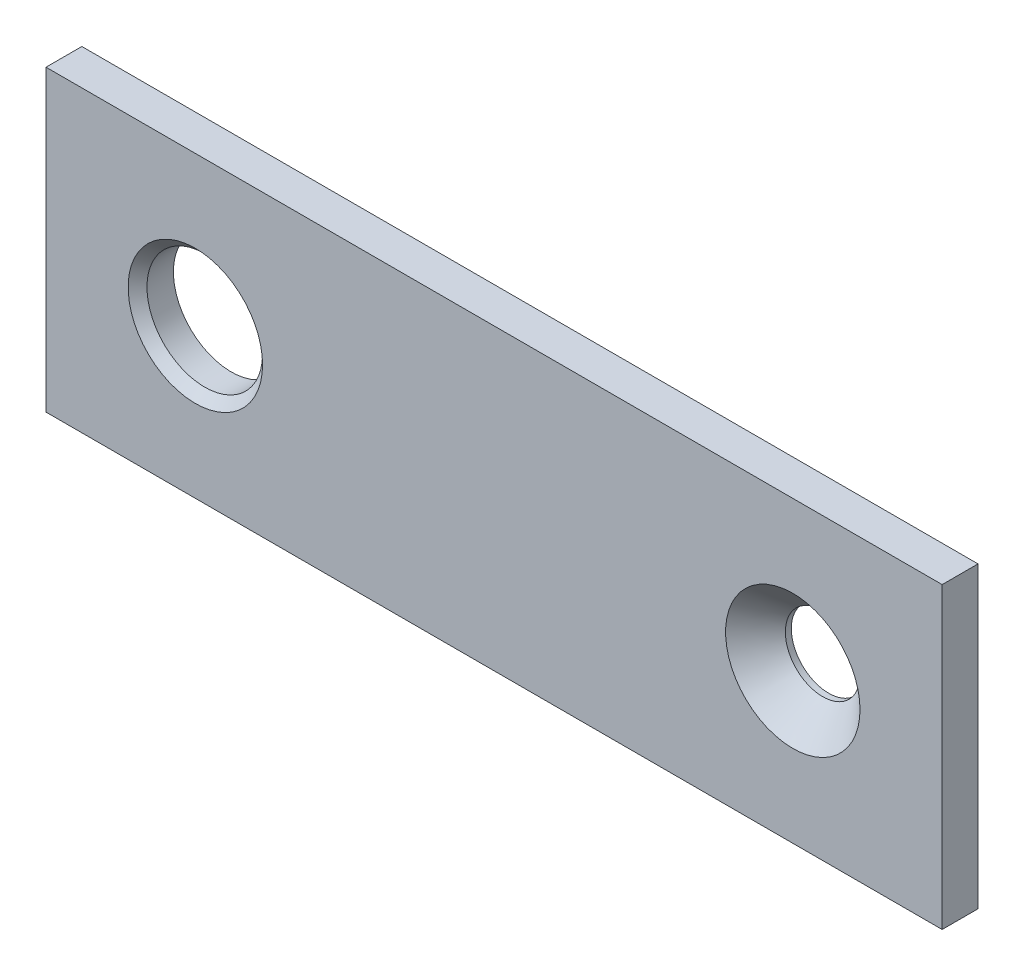
ISO-10303-21;
HEADER;
FILE_DESCRIPTION(('STEP AP214'),'2;1');
FILE_NAME('part.step','',(''),(''),'','','');
FILE_SCHEMA(('AUTOMOTIVE_DESIGN { 1 0 10303 214 1 1 1 1 }'));
ENDSEC;
DATA;
#1=APPLICATION_CONTEXT('core data for automotive mechanical design processes');
#2=APPLICATION_PROTOCOL_DEFINITION('international standard','automotive_design',2000,#1);
#3=PRODUCT_CONTEXT('',#1,'mechanical');
#4=PRODUCT('Part','Part','',(#3));
#5=PRODUCT_RELATED_PRODUCT_CATEGORY('part','',(#4));
#6=PRODUCT_DEFINITION_FORMATION('','',#4);
#7=PRODUCT_DEFINITION_CONTEXT('part definition',#1,'design');
#8=PRODUCT_DEFINITION('design','',#6,#7);
#9=PRODUCT_DEFINITION_SHAPE('','',#8);
#10=(LENGTH_UNIT() NAMED_UNIT(*) SI_UNIT(.MILLI.,.METRE.));
#11=(NAMED_UNIT(*) PLANE_ANGLE_UNIT() SI_UNIT($,.RADIAN.));
#12=(NAMED_UNIT(*) SI_UNIT($,.STERADIAN.) SOLID_ANGLE_UNIT());
#13=UNCERTAINTY_MEASURE_WITH_UNIT(LENGTH_MEASURE(1.E-05),#10,'distance_accuracy_value','');
#14=(GEOMETRIC_REPRESENTATION_CONTEXT(3) GLOBAL_UNCERTAINTY_ASSIGNED_CONTEXT((#13)) GLOBAL_UNIT_ASSIGNED_CONTEXT((#10,
#11,#12)) REPRESENTATION_CONTEXT('',''));
#15=CARTESIAN_POINT('',(0.,0.,0.));
#16=DIRECTION('',(0.,0.,1.));
#17=DIRECTION('',(1.,0.,0.));
#18=AXIS2_PLACEMENT_3D('',#15,#16,#17);
#19=CARTESIAN_POINT('',(-19.05,6.34999999999999,-1.524));
#20=DIRECTION('',(-1.,0.,0.));
#21=DIRECTION('',(0.,-1.,0.));
#22=AXIS2_PLACEMENT_3D('',#19,#20,#21);
#23=PLANE('',#22);
#24=DIRECTION('',(0.,-1.,0.));
#25=VECTOR('',#24,1.);
#26=CARTESIAN_POINT('',(-19.05,6.34999999999999,0.));
#27=LINE('',#26,#25);
#28=CARTESIAN_POINT('',(-19.05,6.34999999999999,0.));
#29=VERTEX_POINT('',#28);
#30=CARTESIAN_POINT('',(-19.05,-6.35000000000001,0.));
#31=VERTEX_POINT('',#30);
#32=EDGE_CURVE('E117',#29,#31,#27,.T.);
#33=ORIENTED_EDGE('',*,*,#32,.F.);
#34=DIRECTION('',(0.,0.,1.));
#35=VECTOR('',#34,1.);
#36=CARTESIAN_POINT('',(-19.05,6.34999999999999,-1.524));
#37=LINE('',#36,#35);
#38=CARTESIAN_POINT('',(-19.05,6.34999999999999,-1.524));
#39=VERTEX_POINT('',#38);
#40=EDGE_CURVE('E65',#39,#29,#37,.T.);
#41=ORIENTED_EDGE('',*,*,#40,.F.);
#42=DIRECTION('',(0.,-1.,0.));
#43=VECTOR('',#42,1.);
#44=CARTESIAN_POINT('',(-19.05,6.34999999999999,-1.524));
#45=LINE('',#44,#43);
#46=CARTESIAN_POINT('',(-19.05,-6.35000000000001,-1.524));
#47=VERTEX_POINT('',#46);
#48=EDGE_CURVE('E110',#39,#47,#45,.T.);
#49=ORIENTED_EDGE('',*,*,#48,.T.);
#50=DIRECTION('',(0.,0.,1.));
#51=VECTOR('',#50,1.);
#52=CARTESIAN_POINT('',(-19.05,-6.35000000000001,-1.524));
#53=LINE('',#52,#51);
#54=EDGE_CURVE('E93',#47,#31,#53,.T.);
#55=ORIENTED_EDGE('',*,*,#54,.T.);
#56=EDGE_LOOP('',(#33,#41,#49,#55));
#57=FACE_BOUND('',#56,.T.);
#58=ADVANCED_FACE('F47',(#57),#23,.T.);
#59=CARTESIAN_POINT('',(-19.05,6.34999999999999,-1.524));
#60=DIRECTION('',(0.,1.,0.));
#61=DIRECTION('',(0.,0.,1.));
#62=AXIS2_PLACEMENT_3D('',#59,#60,#61);
#63=PLANE('',#62);
#64=DIRECTION('',(-1.,0.,0.));
#65=VECTOR('',#64,1.);
#66=CARTESIAN_POINT('',(-19.05,6.34999999999999,0.));
#67=LINE('',#66,#65);
#68=CARTESIAN_POINT('',(19.05,6.34999999999999,0.));
#69=VERTEX_POINT('',#68);
#70=EDGE_CURVE('E112',#69,#29,#67,.T.);
#71=ORIENTED_EDGE('',*,*,#70,.F.);
#72=DIRECTION('',(0.,0.,1.));
#73=VECTOR('',#72,1.);
#74=CARTESIAN_POINT('',(19.05,6.34999999999999,-1.524));
#75=LINE('',#74,#73);
#76=CARTESIAN_POINT('',(19.05,6.34999999999999,-1.524));
#77=VERTEX_POINT('',#76);
#78=EDGE_CURVE('E82',#77,#69,#75,.T.);
#79=ORIENTED_EDGE('',*,*,#78,.F.);
#80=DIRECTION('',(-1.,0.,0.));
#81=VECTOR('',#80,1.);
#82=CARTESIAN_POINT('',(-19.05,6.34999999999999,-1.524));
#83=LINE('',#82,#81);
#84=EDGE_CURVE('E107',#77,#39,#83,.T.);
#85=ORIENTED_EDGE('',*,*,#84,.T.);
#86=ORIENTED_EDGE('',*,*,#40,.T.);
#87=EDGE_LOOP('',(#71,#79,#85,#86));
#88=FACE_BOUND('',#87,.T.);
#89=ADVANCED_FACE('F152',(#88),#63,.T.);
#90=CARTESIAN_POINT('',(19.05,6.34999999999999,-1.524));
#91=DIRECTION('',(1.,0.,0.));
#92=DIRECTION('',(0.,0.,-1.));
#93=AXIS2_PLACEMENT_3D('',#90,#91,#92);
#94=PLANE('',#93);
#95=DIRECTION('',(0.,1.,0.));
#96=VECTOR('',#95,1.);
#97=CARTESIAN_POINT('',(19.05,6.34999999999999,0.));
#98=LINE('',#97,#96);
#99=CARTESIAN_POINT('',(19.05,-6.35000000000001,0.));
#100=VERTEX_POINT('',#99);
#101=EDGE_CURVE('E101',#100,#69,#98,.T.);
#102=ORIENTED_EDGE('',*,*,#101,.F.);
#103=DIRECTION('',(0.,0.,1.));
#104=VECTOR('',#103,1.);
#105=CARTESIAN_POINT('',(19.05,-6.35000000000001,-1.524));
#106=LINE('',#105,#104);
#107=CARTESIAN_POINT('',(19.05,-6.35000000000001,-1.524));
#108=VERTEX_POINT('',#107);
#109=EDGE_CURVE('E96',#108,#100,#106,.T.);
#110=ORIENTED_EDGE('',*,*,#109,.F.);
#111=DIRECTION('',(0.,1.,0.));
#112=VECTOR('',#111,1.);
#113=CARTESIAN_POINT('',(19.05,6.34999999999999,-1.524));
#114=LINE('',#113,#112);
#115=EDGE_CURVE('E99',#108,#77,#114,.T.);
#116=ORIENTED_EDGE('',*,*,#115,.T.);
#117=ORIENTED_EDGE('',*,*,#78,.T.);
#118=EDGE_LOOP('',(#102,#110,#116,#117));
#119=FACE_BOUND('',#118,.T.);
#120=ADVANCED_FACE('F98',(#119),#94,.T.);
#121=CARTESIAN_POINT('',(-19.05,-6.35000000000001,-1.524));
#122=DIRECTION('',(0.,-1.,0.));
#123=DIRECTION('',(1.,0.,0.));
#124=AXIS2_PLACEMENT_3D('',#121,#122,#123);
#125=PLANE('',#124);
#126=DIRECTION('',(1.,0.,0.));
#127=VECTOR('',#126,1.);
#128=CARTESIAN_POINT('',(-19.05,-6.35000000000001,0.));
#129=LINE('',#128,#127);
#130=EDGE_CURVE('E120',#31,#100,#129,.T.);
#131=ORIENTED_EDGE('',*,*,#130,.F.);
#132=ORIENTED_EDGE('',*,*,#54,.F.);
#133=DIRECTION('',(1.,0.,0.));
#134=VECTOR('',#133,1.);
#135=CARTESIAN_POINT('',(-19.05,-6.35000000000001,-1.524));
#136=LINE('',#135,#134);
#137=EDGE_CURVE('E106',#47,#108,#136,.T.);
#138=ORIENTED_EDGE('',*,*,#137,.T.);
#139=ORIENTED_EDGE('',*,*,#109,.T.);
#140=EDGE_LOOP('',(#131,#132,#138,#139));
#141=FACE_BOUND('',#140,.T.);
#142=ADVANCED_FACE('F109',(#141),#125,.T.);
#143=CARTESIAN_POINT('',(-19.05,-6.35000000000001,-1.524));
#144=DIRECTION('',(0.,0.,1.));
#145=DIRECTION('',(1.,0.,0.));
#146=AXIS2_PLACEMENT_3D('',#143,#144,#145);
#147=PLANE('',#146);
#148=CARTESIAN_POINT('',(-12.7,0.,-1.524));
#149=DIRECTION('',(0.,0.,1.));
#150=DIRECTION('',(1.,0.,0.));
#151=AXIS2_PLACEMENT_3D('',#148,#149,#150);
#152=CIRCLE('',#151,2.45745);
#153=CARTESIAN_POINT('',(-10.24255,0.,-1.524));
#154=VERTEX_POINT('',#153);
#155=EDGE_CURVE('E179',#154,#154,#152,.T.);
#156=ORIENTED_EDGE('',*,*,#155,.T.);
#157=EDGE_LOOP('',(#156));
#158=FACE_BOUND('',#157,.T.);
#159=CARTESIAN_POINT('',(12.7,0.,-1.524));
#160=DIRECTION('',(0.,0.,1.));
#161=DIRECTION('',(1.,0.,0.));
#162=AXIS2_PLACEMENT_3D('',#159,#160,#161);
#163=CIRCLE('',#162,1.5875);
#164=CARTESIAN_POINT('',(14.2875,0.,-1.524));
#165=VERTEX_POINT('',#164);
#166=EDGE_CURVE('E121',#165,#165,#163,.T.);
#167=ORIENTED_EDGE('',*,*,#166,.T.);
#168=EDGE_LOOP('',(#167));
#169=FACE_BOUND('',#168,.T.);
#170=ORIENTED_EDGE('',*,*,#48,.F.);
#171=ORIENTED_EDGE('',*,*,#84,.F.);
#172=ORIENTED_EDGE('',*,*,#115,.F.);
#173=ORIENTED_EDGE('',*,*,#137,.F.);
#174=EDGE_LOOP('',(#170,#171,#172,#173));
#175=FACE_BOUND('',#174,.T.);
#176=ADVANCED_FACE('F105',(#158,#169,#175),#147,.F.);
#177=CARTESIAN_POINT('',(-19.05,-6.35000000000001,0.));
#178=DIRECTION('',(0.,0.,1.));
#179=DIRECTION('',(1.,0.,0.));
#180=AXIS2_PLACEMENT_3D('',#177,#178,#179);
#181=PLANE('',#180);
#182=CARTESIAN_POINT('',(12.7,0.,0.));
#183=DIRECTION('',(0.,0.,1.));
#184=DIRECTION('',(1.,0.,0.));
#185=AXIS2_PLACEMENT_3D('',#182,#183,#184);
#186=CIRCLE('',#185,2.85750000000003);
#187=CARTESIAN_POINT('',(15.5575,0.,0.));
#188=VERTEX_POINT('',#187);
#189=EDGE_CURVE('E13',#188,#188,#186,.F.);
#190=ORIENTED_EDGE('',*,*,#189,.T.);
#191=EDGE_LOOP('',(#190));
#192=FACE_BOUND('',#191,.T.);
#193=CARTESIAN_POINT('',(-12.7,0.,0.));
#194=DIRECTION('',(0.,0.,1.));
#195=DIRECTION('',(1.,0.,0.));
#196=AXIS2_PLACEMENT_3D('',#193,#194,#195);
#197=CIRCLE('',#196,2.85750000000003);
#198=CARTESIAN_POINT('',(-9.84249999999996,0.,0.));
#199=VERTEX_POINT('',#198);
#200=EDGE_CURVE('E57',#199,#199,#197,.F.);
#201=ORIENTED_EDGE('',*,*,#200,.T.);
#202=EDGE_LOOP('',(#201));
#203=FACE_BOUND('',#202,.T.);
#204=ORIENTED_EDGE('',*,*,#32,.T.);
#205=ORIENTED_EDGE('',*,*,#130,.T.);
#206=ORIENTED_EDGE('',*,*,#101,.T.);
#207=ORIENTED_EDGE('',*,*,#70,.T.);
#208=EDGE_LOOP('',(#204,#205,#206,#207));
#209=FACE_BOUND('',#208,.T.);
#210=ADVANCED_FACE('F135',(#192,#203,#209),#181,.T.);
#211=CARTESIAN_POINT('',(12.7,0.,-1.524));
#212=DIRECTION('',(0.,0.,1.));
#213=DIRECTION('',(1.,0.,0.));
#214=AXIS2_PLACEMENT_3D('',#211,#212,#213);
#215=CYLINDRICAL_SURFACE('',#214,1.5875);
#216=CARTESIAN_POINT('',(12.7,0.,-1.27000000000002));
#217=DIRECTION('',(0.,0.,1.));
#218=DIRECTION('',(1.,0.,0.));
#219=AXIS2_PLACEMENT_3D('',#216,#217,#218);
#220=CIRCLE('',#219,1.5875);
#221=CARTESIAN_POINT('',(14.2875,0.,-1.27000000000002));
#222=VERTEX_POINT('',#221);
#223=EDGE_CURVE('E127',#222,#222,#220,.T.);
#224=CARTESIAN_POINT('',(14.2875,0.,-1.27000000000002));
#225=CARTESIAN_POINT('',(14.2875,0.,-1.27264583333335));
#226=CARTESIAN_POINT('',(14.2875,0.,-1.27529166666668));
#227=CARTESIAN_POINT('',(14.2875,0.,-1.28058333333335));
#228=CARTESIAN_POINT('',(14.2875,0.,-1.28322916666668));
#229=CARTESIAN_POINT('',(14.2875,0.,-1.28852083333335));
#230=CARTESIAN_POINT('',(14.2875,0.,-1.29116666666668));
#231=CARTESIAN_POINT('',(14.2875,0.,-1.29645833333335));
#232=CARTESIAN_POINT('',(14.2875,0.,-1.29910416666668));
#233=CARTESIAN_POINT('',(14.2875,0.,-1.30439583333335));
#234=CARTESIAN_POINT('',(14.2875,0.,-1.30704166666668));
#235=CARTESIAN_POINT('',(14.2875,0.,-1.31233333333335));
#236=CARTESIAN_POINT('',(14.2875,0.,-1.31497916666668));
#237=CARTESIAN_POINT('',(14.2875,0.,-1.32027083333335));
#238=CARTESIAN_POINT('',(14.2875,0.,-1.32291666666668));
#239=CARTESIAN_POINT('',(14.2875,0.,-1.32820833333335));
#240=CARTESIAN_POINT('',(14.2875,0.,-1.33085416666668));
#241=CARTESIAN_POINT('',(14.2875,0.,-1.33614583333335));
#242=CARTESIAN_POINT('',(14.2875,0.,-1.33879166666668));
#243=CARTESIAN_POINT('',(14.2875,0.,-1.34408333333335));
#244=CARTESIAN_POINT('',(14.2875,0.,-1.34672916666668));
#245=CARTESIAN_POINT('',(14.2875,0.,-1.35202083333335));
#246=CARTESIAN_POINT('',(14.2875,0.,-1.35466666666668));
#247=CARTESIAN_POINT('',(14.2875,0.,-1.35995833333334));
#248=CARTESIAN_POINT('',(14.2875,0.,-1.36260416666668));
#249=CARTESIAN_POINT('',(14.2875,0.,-1.36789583333334));
#250=CARTESIAN_POINT('',(14.2875,0.,-1.37054166666668));
#251=CARTESIAN_POINT('',(14.2875,0.,-1.37583333333334));
#252=CARTESIAN_POINT('',(14.2875,0.,-1.37847916666668));
#253=CARTESIAN_POINT('',(14.2875,0.,-1.38377083333334));
#254=CARTESIAN_POINT('',(14.2875,0.,-1.38641666666668));
#255=CARTESIAN_POINT('',(14.2875,0.,-1.39170833333334));
#256=CARTESIAN_POINT('',(14.2875,0.,-1.39435416666668));
#257=CARTESIAN_POINT('',(14.2875,0.,-1.39964583333334));
#258=CARTESIAN_POINT('',(14.2875,0.,-1.40229166666668));
#259=CARTESIAN_POINT('',(14.2875,0.,-1.40758333333334));
#260=CARTESIAN_POINT('',(14.2875,0.,-1.41022916666667));
#261=CARTESIAN_POINT('',(14.2875,0.,-1.41552083333334));
#262=CARTESIAN_POINT('',(14.2875,0.,-1.41816666666667));
#263=CARTESIAN_POINT('',(14.2875,0.,-1.42345833333334));
#264=CARTESIAN_POINT('',(14.2875,0.,-1.42610416666667));
#265=CARTESIAN_POINT('',(14.2875,0.,-1.43139583333334));
#266=CARTESIAN_POINT('',(14.2875,0.,-1.43404166666667));
#267=CARTESIAN_POINT('',(14.2875,0.,-1.43933333333334));
#268=CARTESIAN_POINT('',(14.2875,0.,-1.44197916666667));
#269=CARTESIAN_POINT('',(14.2875,0.,-1.44727083333334));
#270=CARTESIAN_POINT('',(14.2875,0.,-1.44991666666667));
#271=CARTESIAN_POINT('',(14.2875,0.,-1.45520833333334));
#272=CARTESIAN_POINT('',(14.2875,0.,-1.45785416666667));
#273=CARTESIAN_POINT('',(14.2875,0.,-1.46314583333334));
#274=CARTESIAN_POINT('',(14.2875,0.,-1.46579166666667));
#275=CARTESIAN_POINT('',(14.2875,0.,-1.47108333333334));
#276=CARTESIAN_POINT('',(14.2875,0.,-1.47372916666667));
#277=CARTESIAN_POINT('',(14.2875,0.,-1.47902083333334));
#278=CARTESIAN_POINT('',(14.2875,0.,-1.48166666666667));
#279=CARTESIAN_POINT('',(14.2875,0.,-1.48695833333334));
#280=CARTESIAN_POINT('',(14.2875,0.,-1.48960416666667));
#281=CARTESIAN_POINT('',(14.2875,0.,-1.49489583333334));
#282=CARTESIAN_POINT('',(14.2875,0.,-1.49754166666667));
#283=CARTESIAN_POINT('',(14.2875,0.,-1.50283333333334));
#284=CARTESIAN_POINT('',(14.2875,0.,-1.50547916666667));
#285=CARTESIAN_POINT('',(14.2875,0.,-1.51077083333333));
#286=CARTESIAN_POINT('',(14.2875,0.,-1.51341666666667));
#287=CARTESIAN_POINT('',(14.2875,0.,-1.51870833333333));
#288=CARTESIAN_POINT('',(14.2875,0.,-1.52135416666667));
#289=CARTESIAN_POINT('',(14.2875,0.,-1.524));
#290=B_SPLINE_CURVE_WITH_KNOTS('',3,(#224,#225,#226,#227,#228,#229,#230,#231,#232,#233,#234,
#235,#236,#237,#238,#239,#240,#241,#242,#243,#244,#245,#246,#247,#248,#249,#250,#251,#252,#253,
#254,#255,#256,#257,#258,#259,#260,#261,#262,#263,#264,#265,#266,#267,#268,#269,#270,#271,#272,
#273,#274,#275,#276,#277,#278,#279,#280,#281,#282,#283,#284,#285,#286,#287,#288,#289),
.UNSPECIFIED.,.F.,.F.,(4,2,2,2,2,2,2,2,2,2,2,2,2,2,2,2,2,2,2,2,2,2,2,2,2,2,2,2,2,2,2,2,4),(0.,
0.00793749999999948,0.0158749999999987,0.0238124999999982,0.0317499999999977,0.0396874999999972,
0.0476249999999967,0.0555624999999959,0.0634999999999954,0.0714374999999949,0.0793749999999944,
0.0873124999999939,0.0952499999999933,0.103187499999993,0.111124999999992,0.119062499999992,
0.126999999999991,0.134937499999991,0.14287499999999,0.150812499999989,0.158749999999989,
0.166687499999988,0.174624999999988,0.182562499999987,0.190499999999987,0.198437499999986,
0.206374999999986,0.214312499999985,0.222249999999984,0.230187499999984,0.238124999999983,
0.246062499999983,0.253999999999982),.UNSPECIFIED.);
#291=EDGE_CURVE('BSEAM148',#222,#165,#290,.T.);
#292=ORIENTED_EDGE('',*,*,#223,.T.);
#293=ORIENTED_EDGE('',*,*,#166,.F.);
#294=ORIENTED_EDGE('',*,*,#291,.T.);
#295=ORIENTED_EDGE('',*,*,#291,.F.);
#296=EDGE_LOOP('',(#292,#294,#293,#295));
#297=FACE_BOUND('',#296,.T.);
#298=ADVANCED_FACE('F148',(#297),#215,.F.);
#299=CARTESIAN_POINT('',(12.7,0.,-1.27000000000002));
#300=DIRECTION('',(0.,0.,1.));
#301=DIRECTION('',(1.,0.,0.));
#302=AXIS2_PLACEMENT_3D('',#299,#300,#301);
#303=CONICAL_SURFACE('',#302,1.5875,0.785398163397452);
#304=ORIENTED_EDGE('',*,*,#189,.F.);
#305=EDGE_LOOP('',(#304));
#306=FACE_BOUND('',#305,.T.);
#307=ORIENTED_EDGE('',*,*,#223,.F.);
#308=EDGE_LOOP('',(#307));
#309=FACE_BOUND('',#308,.T.);
#310=ADVANCED_FACE('F140',(#306,#309),#303,.F.);
#311=CARTESIAN_POINT('',(-12.7,0.,-1.27000000000002));
#312=DIRECTION('',(0.,0.,1.));
#313=DIRECTION('',(1.,0.,0.));
#314=AXIS2_PLACEMENT_3D('',#311,#312,#313);
#315=CONICAL_SURFACE('',#314,1.5875,0.785398163397452);
#316=CARTESIAN_POINT('',(-12.7,0.,-0.400050000000032));
#317=DIRECTION('',(0.,0.,1.));
#318=DIRECTION('',(1.,0.,0.));
#319=AXIS2_PLACEMENT_3D('',#316,#317,#318);
#320=CIRCLE('',#319,2.45744999999999);
#321=CARTESIAN_POINT('',(-10.24255,0.,-0.400050000000032));
#322=VERTEX_POINT('',#321);
#323=EDGE_CURVE('E51',#322,#322,#320,.T.);
#324=ORIENTED_EDGE('',*,*,#323,.F.);
#325=EDGE_LOOP('',(#324));
#326=FACE_BOUND('',#325,.T.);
#327=ORIENTED_EDGE('',*,*,#200,.F.);
#328=EDGE_LOOP('',(#327));
#329=FACE_BOUND('',#328,.T.);
#330=ADVANCED_FACE('F49',(#326,#329),#315,.F.);
#331=CARTESIAN_POINT('',(-12.7,0.,0.));
#332=DIRECTION('',(0.,0.,1.));
#333=DIRECTION('',(1.,0.,0.));
#334=AXIS2_PLACEMENT_3D('',#331,#332,#333);
#335=CYLINDRICAL_SURFACE('',#334,2.45744999999999);
#336=ORIENTED_EDGE('',*,*,#323,.T.);
#337=EDGE_LOOP('',(#336));
#338=FACE_BOUND('',#337,.T.);
#339=ORIENTED_EDGE('',*,*,#155,.F.);
#340=EDGE_LOOP('',(#339));
#341=FACE_BOUND('',#340,.T.);
#342=ADVANCED_FACE('F139',(#338,#341),#335,.F.);
#343=CLOSED_SHELL('',(#58,#89,#120,#142,#176,#210,#298,#310,#330,#342));
#344=MANIFOLD_SOLID_BREP('B2',#343);
#345=ADVANCED_BREP_SHAPE_REPRESENTATION('',(#18,#344),#14);
#346=SHAPE_DEFINITION_REPRESENTATION(#9,#345);
ENDSEC;
END-ISO-10303-21;
